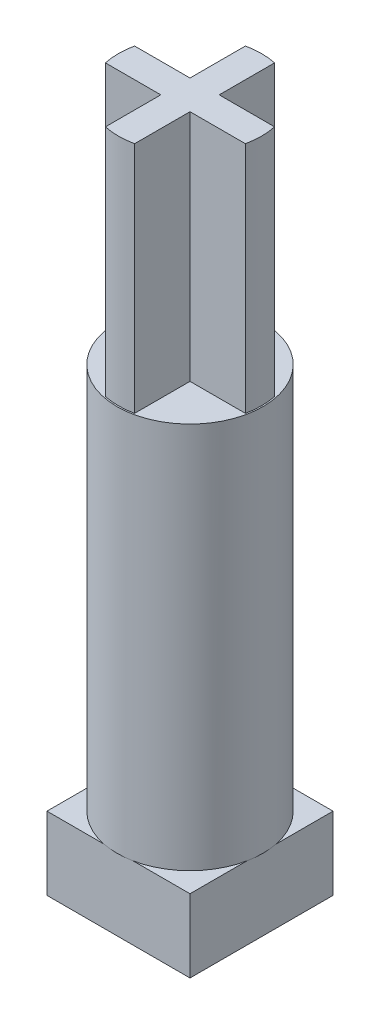
ISO-10303-21;
HEADER;
FILE_DESCRIPTION(('STEP AP214'),'2;1');
FILE_NAME('part.step','',(''),(''),'','','');
FILE_SCHEMA(('AUTOMOTIVE_DESIGN { 1 0 10303 214 1 1 1 1 }'));
ENDSEC;
DATA;
#1=APPLICATION_CONTEXT('core data for automotive mechanical design processes');
#2=APPLICATION_PROTOCOL_DEFINITION('international standard','automotive_design',2000,#1);
#3=PRODUCT_CONTEXT('',#1,'mechanical');
#4=PRODUCT('Part','Part','',(#3));
#5=PRODUCT_RELATED_PRODUCT_CATEGORY('part','',(#4));
#6=PRODUCT_DEFINITION_FORMATION('','',#4);
#7=PRODUCT_DEFINITION_CONTEXT('part definition',#1,'design');
#8=PRODUCT_DEFINITION('design','',#6,#7);
#9=PRODUCT_DEFINITION_SHAPE('','',#8);
#10=(LENGTH_UNIT() NAMED_UNIT(*) SI_UNIT(.MILLI.,.METRE.));
#11=(NAMED_UNIT(*) PLANE_ANGLE_UNIT() SI_UNIT($,.RADIAN.));
#12=(NAMED_UNIT(*) SI_UNIT($,.STERADIAN.) SOLID_ANGLE_UNIT());
#13=UNCERTAINTY_MEASURE_WITH_UNIT(LENGTH_MEASURE(1.E-05),#10,'distance_accuracy_value','');
#14=(GEOMETRIC_REPRESENTATION_CONTEXT(3) GLOBAL_UNCERTAINTY_ASSIGNED_CONTEXT((#13)) GLOBAL_UNIT_ASSIGNED_CONTEXT((#10,
#11,#12)) REPRESENTATION_CONTEXT('',''));
#15=CARTESIAN_POINT('',(0.,0.,0.));
#16=DIRECTION('',(0.,0.,1.));
#17=DIRECTION('',(1.,0.,0.));
#18=AXIS2_PLACEMENT_3D('',#15,#16,#17);
#19=CARTESIAN_POINT('',(-35.4317426595789,-30.6776372888627,44.8719558536028));
#20=DIRECTION('',(0.,-1.,0.));
#21=DIRECTION('',(0.,0.,-1.));
#22=AXIS2_PLACEMENT_3D('',#19,#20,#21);
#23=PLANE('',#22);
#24=DIRECTION('',(0.,0.,1.));
#25=VECTOR('',#24,1.);
#26=CARTESIAN_POINT('',(-32.9817426595789,-30.6776372888627,42.4219558536028));
#27=LINE('',#26,#25);
#28=CARTESIAN_POINT('',(-32.9817426595789,-30.6776372888627,44.3744621350495));
#29=VERTEX_POINT('',#28);
#30=CARTESIAN_POINT('',(-32.9817426595789,-30.6776372888627,45.3694495721561));
#31=VERTEX_POINT('',#30);
#32=EDGE_CURVE('E12',#29,#31,#27,.T.);
#33=ORIENTED_EDGE('',*,*,#32,.F.);
#34=CARTESIAN_POINT('',(-35.4317426595789,-30.6776372888627,44.8719558536028));
#35=DIRECTION('',(0.,-1.,0.));
#36=DIRECTION('',(0.,0.,-1.));
#37=AXIS2_PLACEMENT_3D('',#34,#35,#36);
#38=CIRCLE('',#37,2.5);
#39=EDGE_CURVE('E230',#29,#31,#38,.T.);
#40=ORIENTED_EDGE('',*,*,#39,.T.);
#41=EDGE_LOOP('',(#33,#40));
#42=FACE_BOUND('',#41,.T.);
#43=ADVANCED_FACE('F53',(#42),#23,.T.);
#44=DIRECTION('',(1.,0.,0.));
#45=VECTOR('',#44,1.);
#46=CARTESIAN_POINT('',(-37.8817426595789,-30.6776372888627,42.4219558536028));
#47=LINE('',#46,#45);
#48=CARTESIAN_POINT('',(-35.9292363781323,-30.6776372888627,42.4219558536028));
#49=VERTEX_POINT('',#48);
#50=CARTESIAN_POINT('',(-34.9342489410256,-30.6776372888627,42.4219558536028));
#51=VERTEX_POINT('',#50);
#52=EDGE_CURVE('E62',#49,#51,#47,.T.);
#53=ORIENTED_EDGE('',*,*,#52,.F.);
#54=EDGE_CURVE('E220',#49,#51,#38,.T.);
#55=ORIENTED_EDGE('',*,*,#54,.T.);
#56=EDGE_LOOP('',(#53,#55));
#57=FACE_BOUND('',#56,.T.);
#58=ADVANCED_FACE('F383',(#57),#23,.T.);
#59=DIRECTION('',(0.,0.,-1.));
#60=VECTOR('',#59,1.);
#61=CARTESIAN_POINT('',(-37.8817426595789,-30.6776372888627,42.4219558536028));
#62=LINE('',#61,#60);
#63=CARTESIAN_POINT('',(-37.8817426595789,-30.6776372888627,45.3694495721561));
#64=VERTEX_POINT('',#63);
#65=CARTESIAN_POINT('',(-37.8817426595789,-30.6776372888627,44.3744621350495));
#66=VERTEX_POINT('',#65);
#67=EDGE_CURVE('E323',#64,#66,#62,.T.);
#68=ORIENTED_EDGE('',*,*,#67,.F.);
#69=EDGE_CURVE('E353',#64,#66,#38,.T.);
#70=ORIENTED_EDGE('',*,*,#69,.T.);
#71=EDGE_LOOP('',(#68,#70));
#72=FACE_BOUND('',#71,.T.);
#73=ADVANCED_FACE('F388',(#72),#23,.T.);
#74=CARTESIAN_POINT('',(-35.4317426595789,-18.4276372888627,44.8719558536028));
#75=DIRECTION('',(0.,-1.,0.));
#76=DIRECTION('',(0.,0.,-1.));
#77=AXIS2_PLACEMENT_3D('',#74,#75,#76);
#78=CYLINDRICAL_SURFACE('',#77,2.5);
#79=CARTESIAN_POINT('',(-35.4317426595789,-17.4276372888627,44.8719558536028));
#80=DIRECTION('',(0.,1.,0.));
#81=DIRECTION('',(0.,0.,1.));
#82=AXIS2_PLACEMENT_3D('',#79,#80,#81);
#83=CIRCLE('',#82,2.5);
#84=CARTESIAN_POINT('',(-35.4317426595789,-17.4276372888627,47.3719558536028));
#85=VERTEX_POINT('',#84);
#86=EDGE_CURVE('E57',#85,#85,#83,.T.);
#87=ORIENTED_EDGE('',*,*,#86,.F.);
#88=EDGE_LOOP('',(#87));
#89=FACE_BOUND('',#88,.T.);
#90=EDGE_CURVE('E223',#51,#29,#38,.T.);
#91=ORIENTED_EDGE('',*,*,#90,.F.);
#92=ORIENTED_EDGE('',*,*,#54,.F.);
#93=EDGE_CURVE('E77',#66,#49,#38,.T.);
#94=ORIENTED_EDGE('',*,*,#93,.F.);
#95=ORIENTED_EDGE('',*,*,#69,.F.);
#96=CARTESIAN_POINT('',(-35.9292363781323,-30.6776372888627,47.3219558536028));
#97=VERTEX_POINT('',#96);
#98=EDGE_CURVE('E354',#97,#64,#38,.T.);
#99=ORIENTED_EDGE('',*,*,#98,.F.);
#100=CARTESIAN_POINT('',(-34.9342489410256,-30.6776372888627,47.3219558536028));
#101=VERTEX_POINT('',#100);
#102=EDGE_CURVE('E357',#101,#97,#38,.T.);
#103=ORIENTED_EDGE('',*,*,#102,.F.);
#104=EDGE_CURVE('E360',#31,#101,#38,.T.);
#105=ORIENTED_EDGE('',*,*,#104,.F.);
#106=ORIENTED_EDGE('',*,*,#39,.F.);
#107=EDGE_LOOP('',(#91,#92,#94,#95,#99,#103,#105,#106));
#108=FACE_BOUND('',#107,.T.);
#109=ADVANCED_FACE('F55',(#89,#108),#78,.T.);
#110=CARTESIAN_POINT('',(-35.4317426595789,-17.4276372888627,44.8719558536028));
#111=DIRECTION('',(0.,1.,0.));
#112=DIRECTION('',(0.,0.,1.));
#113=AXIS2_PLACEMENT_3D('',#110,#111,#112);
#114=PLANE('',#113);
#115=ORIENTED_EDGE('',*,*,#86,.T.);
#116=EDGE_LOOP('',(#115));
#117=FACE_BOUND('',#116,.T.);
#118=DIRECTION('',(1.,0.,0.));
#119=VECTOR('',#118,1.);
#120=CARTESIAN_POINT('',(-22.9042632367363,-17.4276372888627,45.3719558536028));
#121=LINE('',#120,#119);
#122=CARTESIAN_POINT('',(-34.9317426595789,-17.4276372888627,45.3719558536028));
#123=VERTEX_POINT('',#122);
#124=CARTESIAN_POINT('',(-33.0333056685366,-17.4276372888627,45.3719558536028));
#125=VERTEX_POINT('',#124);
#126=EDGE_CURVE('E258',#123,#125,#121,.T.);
#127=ORIENTED_EDGE('',*,*,#126,.F.);
#128=DIRECTION('',(0.,0.,1.));
#129=VECTOR('',#128,1.);
#130=CARTESIAN_POINT('',(-34.9317426595789,-17.4276372888627,17.9513586437802));
#131=LINE('',#130,#129);
#132=CARTESIAN_POINT('',(-34.9317426595789,-17.4276372888627,47.2703928446451));
#133=VERTEX_POINT('',#132);
#134=EDGE_CURVE('E229',#123,#133,#131,.T.);
#135=ORIENTED_EDGE('',*,*,#134,.T.);
#136=CARTESIAN_POINT('',(-35.4317426595789,-17.4276372888627,44.8719558536028));
#137=DIRECTION('',(0.,1.,0.));
#138=DIRECTION('',(0.,0.,1.));
#139=AXIS2_PLACEMENT_3D('',#136,#137,#138);
#140=CIRCLE('',#139,2.45);
#141=CARTESIAN_POINT('',(-35.9317426595789,-17.4276372888627,47.2703928446451));
#142=VERTEX_POINT('',#141);
#143=EDGE_CURVE('E235',#142,#133,#140,.T.);
#144=ORIENTED_EDGE('',*,*,#143,.F.);
#145=DIRECTION('',(0.,0.,1.));
#146=VECTOR('',#145,1.);
#147=CARTESIAN_POINT('',(-35.9317426595789,-17.4276372888627,17.9513586437802));
#148=LINE('',#147,#146);
#149=CARTESIAN_POINT('',(-35.9317426595789,-17.4276372888627,45.3719558536028));
#150=VERTEX_POINT('',#149);
#151=EDGE_CURVE('E278',#150,#142,#148,.T.);
#152=ORIENTED_EDGE('',*,*,#151,.F.);
#153=DIRECTION('',(-1.,0.,0.));
#154=VECTOR('',#153,1.);
#155=CARTESIAN_POINT('',(-22.9042632367363,-17.4276372888627,45.3719558536028));
#156=LINE('',#155,#154);
#157=CARTESIAN_POINT('',(-37.8301796506212,-17.4276372888627,45.3719558536028));
#158=VERTEX_POINT('',#157);
#159=EDGE_CURVE('E276',#150,#158,#156,.T.);
#160=ORIENTED_EDGE('',*,*,#159,.T.);
#161=CARTESIAN_POINT('',(-37.8301796506212,-17.4276372888627,44.3719558536028));
#162=VERTEX_POINT('',#161);
#163=EDGE_CURVE('E275',#162,#158,#140,.T.);
#164=ORIENTED_EDGE('',*,*,#163,.F.);
#165=DIRECTION('',(-1.,0.,0.));
#166=VECTOR('',#165,1.);
#167=CARTESIAN_POINT('',(-22.9042632367363,-17.4276372888627,44.3719558536028));
#168=LINE('',#167,#166);
#169=CARTESIAN_POINT('',(-35.9317426595789,-17.4276372888627,44.3719558536028));
#170=VERTEX_POINT('',#169);
#171=EDGE_CURVE('E272',#170,#162,#168,.T.);
#172=ORIENTED_EDGE('',*,*,#171,.F.);
#173=DIRECTION('',(0.,0.,-1.));
#174=VECTOR('',#173,1.);
#175=CARTESIAN_POINT('',(-35.9317426595789,-17.4276372888627,17.9513586437802));
#176=LINE('',#175,#174);
#177=CARTESIAN_POINT('',(-35.9317426595789,-17.4276372888627,42.4735188625605));
#178=VERTEX_POINT('',#177);
#179=EDGE_CURVE('E270',#170,#178,#176,.T.);
#180=ORIENTED_EDGE('',*,*,#179,.T.);
#181=CARTESIAN_POINT('',(-34.9317426595789,-17.4276372888627,42.4735188625605));
#182=VERTEX_POINT('',#181);
#183=EDGE_CURVE('E265',#182,#178,#140,.T.);
#184=ORIENTED_EDGE('',*,*,#183,.F.);
#185=DIRECTION('',(0.,0.,-1.));
#186=VECTOR('',#185,1.);
#187=CARTESIAN_POINT('',(-34.9317426595789,-17.4276372888627,17.9513586437802));
#188=LINE('',#187,#186);
#189=CARTESIAN_POINT('',(-34.9317426595789,-17.4276372888627,44.3719558536028));
#190=VERTEX_POINT('',#189);
#191=EDGE_CURVE('E267',#190,#182,#188,.T.);
#192=ORIENTED_EDGE('',*,*,#191,.F.);
#193=DIRECTION('',(1.,0.,0.));
#194=VECTOR('',#193,1.);
#195=CARTESIAN_POINT('',(-22.9042632367363,-17.4276372888627,44.3719558536028));
#196=LINE('',#195,#194);
#197=CARTESIAN_POINT('',(-33.0333056685366,-17.4276372888627,44.3719558536028));
#198=VERTEX_POINT('',#197);
#199=EDGE_CURVE('E264',#190,#198,#196,.T.);
#200=ORIENTED_EDGE('',*,*,#199,.T.);
#201=EDGE_CURVE('E261',#125,#198,#140,.T.);
#202=ORIENTED_EDGE('',*,*,#201,.F.);
#203=EDGE_LOOP('',(#127,#135,#144,#152,#160,#164,#172,#180,#184,#192,#200,#202));
#204=FACE_BOUND('',#203,.T.);
#205=ADVANCED_FACE('F402',(#117,#204),#114,.T.);
#206=CARTESIAN_POINT('',(-34.9317426595789,-9.42763728886266,17.9513586437802));
#207=DIRECTION('',(1.,0.,0.));
#208=DIRECTION('',(0.,0.,-1.));
#209=AXIS2_PLACEMENT_3D('',#206,#207,#208);
#210=PLANE('',#209);
#211=ORIENTED_EDGE('',*,*,#134,.F.);
#212=DIRECTION('',(0.,-1.,0.));
#213=VECTOR('',#212,1.);
#214=CARTESIAN_POINT('',(-34.9317426595789,-9.42763728886266,45.3719558536028));
#215=LINE('',#214,#213);
#216=CARTESIAN_POINT('',(-34.9317426595789,-9.42763728886266,45.3719558536028));
#217=VERTEX_POINT('',#216);
#218=EDGE_CURVE('E313',#217,#123,#215,.T.);
#219=ORIENTED_EDGE('',*,*,#218,.F.);
#220=DIRECTION('',(0.,0.,1.));
#221=VECTOR('',#220,1.);
#222=CARTESIAN_POINT('',(-34.9317426595789,-9.42763728886266,17.9513586437802));
#223=LINE('',#222,#221);
#224=CARTESIAN_POINT('',(-34.9317426595789,-9.42763728886266,47.2703928446451));
#225=VERTEX_POINT('',#224);
#226=EDGE_CURVE('E231',#217,#225,#223,.T.);
#227=ORIENTED_EDGE('',*,*,#226,.T.);
#228=DIRECTION('',(0.,-1.,0.));
#229=VECTOR('',#228,1.);
#230=CARTESIAN_POINT('',(-34.9317426595789,-9.42763728886266,47.2703928446451));
#231=LINE('',#230,#229);
#232=EDGE_CURVE('E281',#225,#133,#231,.T.);
#233=ORIENTED_EDGE('',*,*,#232,.T.);
#234=EDGE_LOOP('',(#211,#219,#227,#233));
#235=FACE_BOUND('',#234,.T.);
#236=ADVANCED_FACE('F407',(#235),#210,.T.);
#237=CARTESIAN_POINT('',(-22.9042632367363,-9.42763728886266,45.3719558536028));
#238=DIRECTION('',(0.,0.,-1.));
#239=DIRECTION('',(-1.,0.,0.));
#240=AXIS2_PLACEMENT_3D('',#237,#238,#239);
#241=PLANE('',#240);
#242=ORIENTED_EDGE('',*,*,#126,.T.);
#243=DIRECTION('',(0.,-1.,0.));
#244=VECTOR('',#243,1.);
#245=CARTESIAN_POINT('',(-33.0333056685366,-9.42763728886266,45.3719558536028));
#246=LINE('',#245,#244);
#247=CARTESIAN_POINT('',(-33.0333056685366,-9.42763728886266,45.3719558536028));
#248=VERTEX_POINT('',#247);
#249=EDGE_CURVE('E311',#248,#125,#246,.T.);
#250=ORIENTED_EDGE('',*,*,#249,.F.);
#251=DIRECTION('',(1.,0.,0.));
#252=VECTOR('',#251,1.);
#253=CARTESIAN_POINT('',(-22.9042632367363,-9.42763728886266,45.3719558536028));
#254=LINE('',#253,#252);
#255=EDGE_CURVE('E234',#217,#248,#254,.T.);
#256=ORIENTED_EDGE('',*,*,#255,.F.);
#257=ORIENTED_EDGE('',*,*,#218,.T.);
#258=EDGE_LOOP('',(#242,#250,#256,#257));
#259=FACE_BOUND('',#258,.T.);
#260=ADVANCED_FACE('F411',(#259),#241,.F.);
#261=CARTESIAN_POINT('',(-35.4317426595789,-9.42763728886266,44.8719558536028));
#262=DIRECTION('',(0.,-1.,0.));
#263=DIRECTION('',(0.,0.,-1.));
#264=AXIS2_PLACEMENT_3D('',#261,#262,#263);
#265=CYLINDRICAL_SURFACE('',#264,2.45);
#266=ORIENTED_EDGE('',*,*,#201,.T.);
#267=DIRECTION('',(0.,-1.,0.));
#268=VECTOR('',#267,1.);
#269=CARTESIAN_POINT('',(-33.0333056685366,-9.42763728886266,44.3719558536028));
#270=LINE('',#269,#268);
#271=CARTESIAN_POINT('',(-33.0333056685366,-9.42763728886266,44.3719558536028));
#272=VERTEX_POINT('',#271);
#273=EDGE_CURVE('E308',#272,#198,#270,.T.);
#274=ORIENTED_EDGE('',*,*,#273,.F.);
#275=CARTESIAN_POINT('',(-35.4317426595789,-9.42763728886266,44.8719558536028));
#276=DIRECTION('',(0.,1.,0.));
#277=DIRECTION('',(0.,0.,1.));
#278=AXIS2_PLACEMENT_3D('',#275,#276,#277);
#279=CIRCLE('',#278,2.45);
#280=EDGE_CURVE('E237',#248,#272,#279,.T.);
#281=ORIENTED_EDGE('',*,*,#280,.F.);
#282=ORIENTED_EDGE('',*,*,#249,.T.);
#283=EDGE_LOOP('',(#266,#274,#281,#282));
#284=FACE_BOUND('',#283,.T.);
#285=ADVANCED_FACE('F418',(#284),#265,.T.);
#286=CARTESIAN_POINT('',(-22.9042632367363,-9.42763728886266,44.3719558536028));
#287=DIRECTION('',(0.,0.,-1.));
#288=DIRECTION('',(-1.,0.,0.));
#289=AXIS2_PLACEMENT_3D('',#286,#287,#288);
#290=PLANE('',#289);
#291=ORIENTED_EDGE('',*,*,#199,.F.);
#292=DIRECTION('',(0.,-1.,0.));
#293=VECTOR('',#292,1.);
#294=CARTESIAN_POINT('',(-34.9317426595789,-9.42763728886266,44.3719558536028));
#295=LINE('',#294,#293);
#296=CARTESIAN_POINT('',(-34.9317426595789,-9.42763728886266,44.3719558536028));
#297=VERTEX_POINT('',#296);
#298=EDGE_CURVE('E305',#297,#190,#295,.T.);
#299=ORIENTED_EDGE('',*,*,#298,.F.);
#300=DIRECTION('',(1.,0.,0.));
#301=VECTOR('',#300,1.);
#302=CARTESIAN_POINT('',(-22.9042632367363,-9.42763728886266,44.3719558536028));
#303=LINE('',#302,#301);
#304=EDGE_CURVE('E239',#297,#272,#303,.T.);
#305=ORIENTED_EDGE('',*,*,#304,.T.);
#306=ORIENTED_EDGE('',*,*,#273,.T.);
#307=EDGE_LOOP('',(#291,#299,#305,#306));
#308=FACE_BOUND('',#307,.T.);
#309=ADVANCED_FACE('F419',(#308),#290,.T.);
#310=CARTESIAN_POINT('',(-34.9317426595789,-9.42763728886266,17.9513586437802));
#311=DIRECTION('',(-1.,0.,0.));
#312=DIRECTION('',(0.,0.,1.));
#313=AXIS2_PLACEMENT_3D('',#310,#311,#312);
#314=PLANE('',#313);
#315=ORIENTED_EDGE('',*,*,#191,.T.);
#316=DIRECTION('',(0.,-1.,0.));
#317=VECTOR('',#316,1.);
#318=CARTESIAN_POINT('',(-34.9317426595789,-9.42763728886266,42.4735188625605));
#319=LINE('',#318,#317);
#320=CARTESIAN_POINT('',(-34.9317426595789,-9.42763728886266,42.4735188625605));
#321=VERTEX_POINT('',#320);
#322=EDGE_CURVE('E302',#321,#182,#319,.T.);
#323=ORIENTED_EDGE('',*,*,#322,.F.);
#324=DIRECTION('',(0.,0.,-1.));
#325=VECTOR('',#324,1.);
#326=CARTESIAN_POINT('',(-34.9317426595789,-9.42763728886266,17.9513586437802));
#327=LINE('',#326,#325);
#328=EDGE_CURVE('E244',#297,#321,#327,.T.);
#329=ORIENTED_EDGE('',*,*,#328,.F.);
#330=ORIENTED_EDGE('',*,*,#298,.T.);
#331=EDGE_LOOP('',(#315,#323,#329,#330));
#332=FACE_BOUND('',#331,.T.);
#333=ADVANCED_FACE('F422',(#332),#314,.F.);
#334=ORIENTED_EDGE('',*,*,#183,.T.);
#335=DIRECTION('',(0.,-1.,0.));
#336=VECTOR('',#335,1.);
#337=CARTESIAN_POINT('',(-35.9317426595789,-9.42763728886266,42.4735188625605));
#338=LINE('',#337,#336);
#339=CARTESIAN_POINT('',(-35.9317426595789,-9.42763728886266,42.4735188625605));
#340=VERTEX_POINT('',#339);
#341=EDGE_CURVE('E299',#340,#178,#338,.T.);
#342=ORIENTED_EDGE('',*,*,#341,.F.);
#343=EDGE_CURVE('E241',#321,#340,#279,.T.);
#344=ORIENTED_EDGE('',*,*,#343,.F.);
#345=ORIENTED_EDGE('',*,*,#322,.T.);
#346=EDGE_LOOP('',(#334,#342,#344,#345));
#347=FACE_BOUND('',#346,.T.);
#348=ADVANCED_FACE('F426',(#347),#265,.T.);
#349=CARTESIAN_POINT('',(-35.9317426595789,-9.42763728886266,17.9513586437802));
#350=DIRECTION('',(-1.,0.,0.));
#351=DIRECTION('',(0.,0.,1.));
#352=AXIS2_PLACEMENT_3D('',#349,#350,#351);
#353=PLANE('',#352);
#354=ORIENTED_EDGE('',*,*,#179,.F.);
#355=DIRECTION('',(0.,-1.,0.));
#356=VECTOR('',#355,1.);
#357=CARTESIAN_POINT('',(-35.9317426595789,-9.42763728886266,44.3719558536028));
#358=LINE('',#357,#356);
#359=CARTESIAN_POINT('',(-35.9317426595789,-9.42763728886266,44.3719558536028));
#360=VERTEX_POINT('',#359);
#361=EDGE_CURVE('E296',#360,#170,#358,.T.);
#362=ORIENTED_EDGE('',*,*,#361,.F.);
#363=DIRECTION('',(0.,0.,-1.));
#364=VECTOR('',#363,1.);
#365=CARTESIAN_POINT('',(-35.9317426595789,-9.42763728886266,17.9513586437802));
#366=LINE('',#365,#364);
#367=EDGE_CURVE('E246',#360,#340,#366,.T.);
#368=ORIENTED_EDGE('',*,*,#367,.T.);
#369=ORIENTED_EDGE('',*,*,#341,.T.);
#370=EDGE_LOOP('',(#354,#362,#368,#369));
#371=FACE_BOUND('',#370,.T.);
#372=ADVANCED_FACE('F428',(#371),#353,.T.);
#373=CARTESIAN_POINT('',(-22.9042632367363,-9.42763728886266,44.3719558536028));
#374=DIRECTION('',(0.,0.,1.));
#375=DIRECTION('',(1.,0.,0.));
#376=AXIS2_PLACEMENT_3D('',#373,#374,#375);
#377=PLANE('',#376);
#378=ORIENTED_EDGE('',*,*,#171,.T.);
#379=DIRECTION('',(0.,-1.,0.));
#380=VECTOR('',#379,1.);
#381=CARTESIAN_POINT('',(-37.8301796506212,-9.42763728886266,44.3719558536028));
#382=LINE('',#381,#380);
#383=CARTESIAN_POINT('',(-37.8301796506212,-9.42763728886266,44.3719558536028));
#384=VERTEX_POINT('',#383);
#385=EDGE_CURVE('E293',#384,#162,#382,.T.);
#386=ORIENTED_EDGE('',*,*,#385,.F.);
#387=DIRECTION('',(-1.,0.,0.));
#388=VECTOR('',#387,1.);
#389=CARTESIAN_POINT('',(-22.9042632367363,-9.42763728886266,44.3719558536028));
#390=LINE('',#389,#388);
#391=EDGE_CURVE('E249',#360,#384,#390,.T.);
#392=ORIENTED_EDGE('',*,*,#391,.F.);
#393=ORIENTED_EDGE('',*,*,#361,.T.);
#394=EDGE_LOOP('',(#378,#386,#392,#393));
#395=FACE_BOUND('',#394,.T.);
#396=ADVANCED_FACE('F431',(#395),#377,.F.);
#397=ORIENTED_EDGE('',*,*,#163,.T.);
#398=DIRECTION('',(0.,-1.,0.));
#399=VECTOR('',#398,1.);
#400=CARTESIAN_POINT('',(-37.8301796506212,-9.42763728886266,45.3719558536028));
#401=LINE('',#400,#399);
#402=CARTESIAN_POINT('',(-37.8301796506212,-9.42763728886266,45.3719558536028));
#403=VERTEX_POINT('',#402);
#404=EDGE_CURVE('E290',#403,#158,#401,.T.);
#405=ORIENTED_EDGE('',*,*,#404,.F.);
#406=EDGE_CURVE('E251',#384,#403,#279,.T.);
#407=ORIENTED_EDGE('',*,*,#406,.F.);
#408=ORIENTED_EDGE('',*,*,#385,.T.);
#409=EDGE_LOOP('',(#397,#405,#407,#408));
#410=FACE_BOUND('',#409,.T.);
#411=ADVANCED_FACE('F435',(#410),#265,.T.);
#412=CARTESIAN_POINT('',(-22.9042632367363,-9.42763728886266,45.3719558536028));
#413=DIRECTION('',(0.,0.,1.));
#414=DIRECTION('',(1.,0.,0.));
#415=AXIS2_PLACEMENT_3D('',#412,#413,#414);
#416=PLANE('',#415);
#417=ORIENTED_EDGE('',*,*,#159,.F.);
#418=DIRECTION('',(0.,-1.,0.));
#419=VECTOR('',#418,1.);
#420=CARTESIAN_POINT('',(-35.9317426595789,-9.42763728886266,45.3719558536028));
#421=LINE('',#420,#419);
#422=CARTESIAN_POINT('',(-35.9317426595789,-9.42763728886266,45.3719558536028));
#423=VERTEX_POINT('',#422);
#424=EDGE_CURVE('E287',#423,#150,#421,.T.);
#425=ORIENTED_EDGE('',*,*,#424,.F.);
#426=DIRECTION('',(-1.,0.,0.));
#427=VECTOR('',#426,1.);
#428=CARTESIAN_POINT('',(-22.9042632367363,-9.42763728886266,45.3719558536028));
#429=LINE('',#428,#427);
#430=EDGE_CURVE('E252',#423,#403,#429,.T.);
#431=ORIENTED_EDGE('',*,*,#430,.T.);
#432=ORIENTED_EDGE('',*,*,#404,.T.);
#433=EDGE_LOOP('',(#417,#425,#431,#432));
#434=FACE_BOUND('',#433,.T.);
#435=ADVANCED_FACE('F437',(#434),#416,.T.);
#436=CARTESIAN_POINT('',(-35.9317426595789,-9.42763728886266,17.9513586437802));
#437=DIRECTION('',(1.,0.,0.));
#438=DIRECTION('',(0.,0.,-1.));
#439=AXIS2_PLACEMENT_3D('',#436,#437,#438);
#440=PLANE('',#439);
#441=ORIENTED_EDGE('',*,*,#151,.T.);
#442=DIRECTION('',(0.,-1.,0.));
#443=VECTOR('',#442,1.);
#444=CARTESIAN_POINT('',(-35.9317426595789,-9.42763728886266,47.2703928446451));
#445=LINE('',#444,#443);
#446=CARTESIAN_POINT('',(-35.9317426595789,-9.42763728886266,47.2703928446451));
#447=VERTEX_POINT('',#446);
#448=EDGE_CURVE('E284',#447,#142,#445,.T.);
#449=ORIENTED_EDGE('',*,*,#448,.F.);
#450=DIRECTION('',(0.,0.,1.));
#451=VECTOR('',#450,1.);
#452=CARTESIAN_POINT('',(-35.9317426595789,-9.42763728886266,17.9513586437802));
#453=LINE('',#452,#451);
#454=EDGE_CURVE('E255',#423,#447,#453,.T.);
#455=ORIENTED_EDGE('',*,*,#454,.F.);
#456=ORIENTED_EDGE('',*,*,#424,.T.);
#457=EDGE_LOOP('',(#441,#449,#455,#456));
#458=FACE_BOUND('',#457,.T.);
#459=ADVANCED_FACE('F440',(#458),#440,.F.);
#460=ORIENTED_EDGE('',*,*,#143,.T.);
#461=ORIENTED_EDGE('',*,*,#232,.F.);
#462=EDGE_CURVE('E240',#447,#225,#279,.T.);
#463=ORIENTED_EDGE('',*,*,#462,.F.);
#464=ORIENTED_EDGE('',*,*,#448,.T.);
#465=EDGE_LOOP('',(#460,#461,#463,#464));
#466=FACE_BOUND('',#465,.T.);
#467=ADVANCED_FACE('F396',(#466),#265,.T.);
#468=CARTESIAN_POINT('',(-22.9042632367363,-9.42763728886266,17.9513586437802));
#469=DIRECTION('',(0.,1.,0.));
#470=DIRECTION('',(0.,0.,1.));
#471=AXIS2_PLACEMENT_3D('',#468,#469,#470);
#472=PLANE('',#471);
#473=ORIENTED_EDGE('',*,*,#226,.F.);
#474=ORIENTED_EDGE('',*,*,#255,.T.);
#475=ORIENTED_EDGE('',*,*,#280,.T.);
#476=ORIENTED_EDGE('',*,*,#304,.F.);
#477=ORIENTED_EDGE('',*,*,#328,.T.);
#478=ORIENTED_EDGE('',*,*,#343,.T.);
#479=ORIENTED_EDGE('',*,*,#367,.F.);
#480=ORIENTED_EDGE('',*,*,#391,.T.);
#481=ORIENTED_EDGE('',*,*,#406,.T.);
#482=ORIENTED_EDGE('',*,*,#430,.F.);
#483=ORIENTED_EDGE('',*,*,#454,.T.);
#484=ORIENTED_EDGE('',*,*,#462,.T.);
#485=EDGE_LOOP('',(#473,#474,#475,#476,#477,#478,#479,#480,#481,#482,#483,#484));
#486=FACE_BOUND('',#485,.T.);
#487=ADVANCED_FACE('F392',(#486),#472,.T.);
#488=DIRECTION('',(-1.,0.,0.));
#489=VECTOR('',#488,1.);
#490=CARTESIAN_POINT('',(-37.8817426595789,-30.6776372888627,47.3219558536028));
#491=LINE('',#490,#489);
#492=EDGE_CURVE('E319',#101,#97,#491,.T.);
#493=ORIENTED_EDGE('',*,*,#492,.F.);
#494=ORIENTED_EDGE('',*,*,#102,.T.);
#495=EDGE_LOOP('',(#493,#494));
#496=FACE_BOUND('',#495,.T.);
#497=ADVANCED_FACE('F378',(#496),#23,.T.);
#498=CARTESIAN_POINT('',(0.,-30.6776372888627,0.));
#499=DIRECTION('',(0.,1.,0.));
#500=DIRECTION('',(0.,0.,1.));
#501=AXIS2_PLACEMENT_3D('',#498,#499,#500);
#502=PLANE('',#501);
#503=CARTESIAN_POINT('',(-32.9817426595789,-30.6776372888627,42.4219558536028));
#504=VERTEX_POINT('',#503);
#505=EDGE_CURVE('E347',#51,#504,#47,.T.);
#506=ORIENTED_EDGE('',*,*,#505,.F.);
#507=ORIENTED_EDGE('',*,*,#90,.T.);
#508=EDGE_CURVE('E64',#504,#29,#27,.T.);
#509=ORIENTED_EDGE('',*,*,#508,.F.);
#510=EDGE_LOOP('',(#506,#507,#509));
#511=FACE_BOUND('',#510,.T.);
#512=ADVANCED_FACE('F372',(#511),#502,.T.);
#513=CARTESIAN_POINT('',(-32.9817426595789,-30.6776372888627,47.3219558536028));
#514=VERTEX_POINT('',#513);
#515=EDGE_CURVE('E65',#31,#514,#27,.T.);
#516=ORIENTED_EDGE('',*,*,#515,.F.);
#517=ORIENTED_EDGE('',*,*,#104,.T.);
#518=EDGE_CURVE('E325',#514,#101,#491,.T.);
#519=ORIENTED_EDGE('',*,*,#518,.F.);
#520=EDGE_LOOP('',(#516,#517,#519));
#521=FACE_BOUND('',#520,.T.);
#522=ADVANCED_FACE('F369',(#521),#502,.T.);
#523=CARTESIAN_POINT('',(-37.8817426595789,-30.6776372888627,47.3219558536028));
#524=VERTEX_POINT('',#523);
#525=EDGE_CURVE('E326',#97,#524,#491,.T.);
#526=ORIENTED_EDGE('',*,*,#525,.F.);
#527=ORIENTED_EDGE('',*,*,#98,.T.);
#528=EDGE_CURVE('E329',#524,#64,#62,.T.);
#529=ORIENTED_EDGE('',*,*,#528,.F.);
#530=EDGE_LOOP('',(#526,#527,#529));
#531=FACE_BOUND('',#530,.T.);
#532=ADVANCED_FACE('F371',(#531),#502,.T.);
#533=CARTESIAN_POINT('',(-32.9817426595789,-33.1776372888627,42.4219558536028));
#534=DIRECTION('',(-1.,0.,0.));
#535=DIRECTION('',(0.,0.,1.));
#536=AXIS2_PLACEMENT_3D('',#533,#534,#535);
#537=PLANE('',#536);
#538=ORIENTED_EDGE('',*,*,#508,.T.);
#539=ORIENTED_EDGE('',*,*,#32,.T.);
#540=ORIENTED_EDGE('',*,*,#515,.T.);
#541=DIRECTION('',(0.,1.,0.));
#542=VECTOR('',#541,1.);
#543=CARTESIAN_POINT('',(-32.9817426595789,-33.1776372888627,47.3219558536028));
#544=LINE('',#543,#542);
#545=CARTESIAN_POINT('',(-32.9817426595789,-33.1776372888627,47.3219558536028));
#546=VERTEX_POINT('',#545);
#547=EDGE_CURVE('E199',#546,#514,#544,.T.);
#548=ORIENTED_EDGE('',*,*,#547,.F.);
#549=DIRECTION('',(0.,0.,1.));
#550=VECTOR('',#549,1.);
#551=CARTESIAN_POINT('',(-32.9817426595789,-33.1776372888627,42.4219558536028));
#552=LINE('',#551,#550);
#553=CARTESIAN_POINT('',(-32.9817426595789,-33.1776372888627,42.4219558536028));
#554=VERTEX_POINT('',#553);
#555=EDGE_CURVE('E205',#554,#546,#552,.T.);
#556=ORIENTED_EDGE('',*,*,#555,.F.);
#557=DIRECTION('',(0.,1.,0.));
#558=VECTOR('',#557,1.);
#559=CARTESIAN_POINT('',(-32.9817426595789,-33.1776372888627,42.4219558536028));
#560=LINE('',#559,#558);
#561=EDGE_CURVE('E335',#554,#504,#560,.T.);
#562=ORIENTED_EDGE('',*,*,#561,.T.);
#563=EDGE_LOOP('',(#538,#539,#540,#548,#556,#562));
#564=FACE_BOUND('',#563,.T.);
#565=ADVANCED_FACE('F217',(#564),#537,.F.);
#566=CARTESIAN_POINT('',(-37.8817426595789,-33.1776372888627,47.3219558536028));
#567=DIRECTION('',(0.,0.,-1.));
#568=DIRECTION('',(-1.,0.,0.));
#569=AXIS2_PLACEMENT_3D('',#566,#567,#568);
#570=PLANE('',#569);
#571=ORIENTED_EDGE('',*,*,#518,.T.);
#572=ORIENTED_EDGE('',*,*,#492,.T.);
#573=ORIENTED_EDGE('',*,*,#525,.T.);
#574=DIRECTION('',(0.,1.,0.));
#575=VECTOR('',#574,1.);
#576=CARTESIAN_POINT('',(-37.8817426595789,-33.1776372888627,47.3219558536028));
#577=LINE('',#576,#575);
#578=CARTESIAN_POINT('',(-37.8817426595789,-33.1776372888627,47.3219558536028));
#579=VERTEX_POINT('',#578);
#580=EDGE_CURVE('E201',#579,#524,#577,.T.);
#581=ORIENTED_EDGE('',*,*,#580,.F.);
#582=DIRECTION('',(-1.,0.,0.));
#583=VECTOR('',#582,1.);
#584=CARTESIAN_POINT('',(-37.8817426595789,-33.1776372888627,47.3219558536028));
#585=LINE('',#584,#583);
#586=EDGE_CURVE('E194',#546,#579,#585,.T.);
#587=ORIENTED_EDGE('',*,*,#586,.F.);
#588=ORIENTED_EDGE('',*,*,#547,.T.);
#589=EDGE_LOOP('',(#571,#572,#573,#581,#587,#588));
#590=FACE_BOUND('',#589,.T.);
#591=ADVANCED_FACE('F197',(#590),#570,.F.);
#592=CARTESIAN_POINT('',(-37.8817426595789,-33.1776372888627,42.4219558536028));
#593=DIRECTION('',(1.,0.,0.));
#594=DIRECTION('',(0.,0.,-1.));
#595=AXIS2_PLACEMENT_3D('',#592,#593,#594);
#596=PLANE('',#595);
#597=ORIENTED_EDGE('',*,*,#528,.T.);
#598=ORIENTED_EDGE('',*,*,#67,.T.);
#599=CARTESIAN_POINT('',(-37.8817426595789,-30.6776372888627,42.4219558536028));
#600=VERTEX_POINT('',#599);
#601=EDGE_CURVE('E330',#66,#600,#62,.T.);
#602=ORIENTED_EDGE('',*,*,#601,.T.);
#603=DIRECTION('',(0.,1.,0.));
#604=VECTOR('',#603,1.);
#605=CARTESIAN_POINT('',(-37.8817426595789,-33.1776372888627,42.4219558536028));
#606=LINE('',#605,#604);
#607=CARTESIAN_POINT('',(-37.8817426595789,-33.1776372888627,42.4219558536028));
#608=VERTEX_POINT('',#607);
#609=EDGE_CURVE('E224',#608,#600,#606,.T.);
#610=ORIENTED_EDGE('',*,*,#609,.F.);
#611=DIRECTION('',(0.,0.,-1.));
#612=VECTOR('',#611,1.);
#613=CARTESIAN_POINT('',(-37.8817426595789,-33.1776372888627,42.4219558536028));
#614=LINE('',#613,#612);
#615=EDGE_CURVE('E204',#579,#608,#614,.T.);
#616=ORIENTED_EDGE('',*,*,#615,.F.);
#617=ORIENTED_EDGE('',*,*,#580,.T.);
#618=EDGE_LOOP('',(#597,#598,#602,#610,#616,#617));
#619=FACE_BOUND('',#618,.T.);
#620=ADVANCED_FACE('F340',(#619),#596,.F.);
#621=CARTESIAN_POINT('',(-37.8817426595789,-33.1776372888627,42.4219558536028));
#622=DIRECTION('',(0.,0.,1.));
#623=DIRECTION('',(1.,0.,0.));
#624=AXIS2_PLACEMENT_3D('',#621,#622,#623);
#625=PLANE('',#624);
#626=EDGE_CURVE('E214',#600,#49,#47,.T.);
#627=ORIENTED_EDGE('',*,*,#626,.T.);
#628=ORIENTED_EDGE('',*,*,#52,.T.);
#629=ORIENTED_EDGE('',*,*,#505,.T.);
#630=ORIENTED_EDGE('',*,*,#561,.F.);
#631=DIRECTION('',(1.,0.,0.));
#632=VECTOR('',#631,1.);
#633=CARTESIAN_POINT('',(-37.8817426595789,-33.1776372888627,42.4219558536028));
#634=LINE('',#633,#632);
#635=EDGE_CURVE('E210',#608,#554,#634,.T.);
#636=ORIENTED_EDGE('',*,*,#635,.F.);
#637=ORIENTED_EDGE('',*,*,#609,.T.);
#638=EDGE_LOOP('',(#627,#628,#629,#630,#636,#637));
#639=FACE_BOUND('',#638,.T.);
#640=ADVANCED_FACE('F345',(#639),#625,.F.);
#641=CARTESIAN_POINT('',(0.,-33.1776372888627,0.));
#642=DIRECTION('',(0.,1.,0.));
#643=DIRECTION('',(0.,0.,1.));
#644=AXIS2_PLACEMENT_3D('',#641,#642,#643);
#645=PLANE('',#644);
#646=ORIENTED_EDGE('',*,*,#555,.T.);
#647=ORIENTED_EDGE('',*,*,#586,.T.);
#648=ORIENTED_EDGE('',*,*,#615,.T.);
#649=ORIENTED_EDGE('',*,*,#635,.T.);
#650=EDGE_LOOP('',(#646,#647,#648,#649));
#651=FACE_BOUND('',#650,.T.);
#652=ADVANCED_FACE('F208',(#651),#645,.F.);
#653=ORIENTED_EDGE('',*,*,#601,.F.);
#654=ORIENTED_EDGE('',*,*,#93,.T.);
#655=ORIENTED_EDGE('',*,*,#626,.F.);
#656=EDGE_LOOP('',(#653,#654,#655));
#657=FACE_BOUND('',#656,.T.);
#658=ADVANCED_FACE('F352',(#657),#502,.T.);
#659=CLOSED_SHELL('',(#43,#58,#73,#109,#205,#236,#260,#285,#309,#333,#348,#372,#396,#411,#435,
#459,#467,#487,#497,#512,#522,#532,#565,#591,#620,#640,#652,#658));
#660=MANIFOLD_SOLID_BREP('B2',#659);
#661=ADVANCED_BREP_SHAPE_REPRESENTATION('',(#18,#660),#14);
#662=SHAPE_DEFINITION_REPRESENTATION(#9,#661);
ENDSEC;
END-ISO-10303-21;
